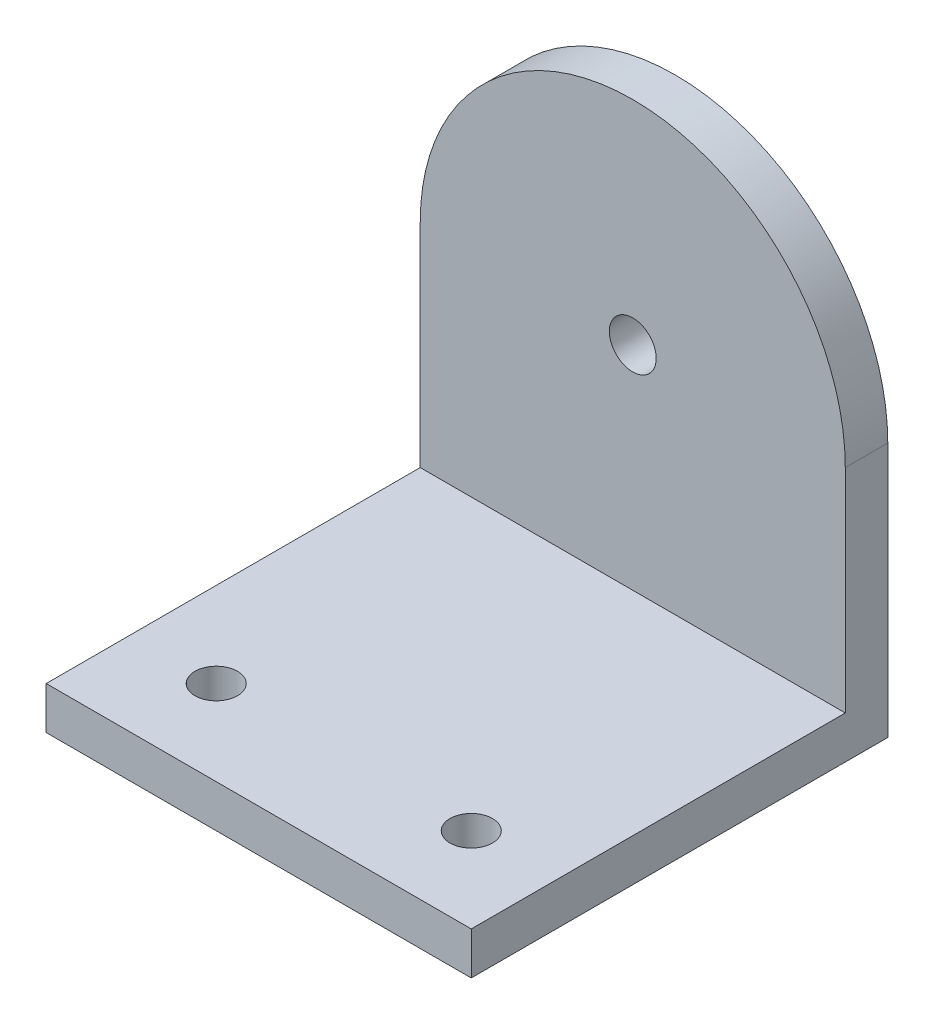
ISO-10303-21;
HEADER;
FILE_DESCRIPTION(('STEP AP214'),'2;1');
FILE_NAME('part.step','',(''),(''),'','','');
FILE_SCHEMA(('AUTOMOTIVE_DESIGN { 1 0 10303 214 1 1 1 1 }'));
ENDSEC;
DATA;
#1=APPLICATION_CONTEXT('core data for automotive mechanical design processes');
#2=APPLICATION_PROTOCOL_DEFINITION('international standard','automotive_design',2000,#1);
#3=PRODUCT_CONTEXT('',#1,'mechanical');
#4=PRODUCT('Part','Part','',(#3));
#5=PRODUCT_RELATED_PRODUCT_CATEGORY('part','',(#4));
#6=PRODUCT_DEFINITION_FORMATION('','',#4);
#7=PRODUCT_DEFINITION_CONTEXT('part definition',#1,'design');
#8=PRODUCT_DEFINITION('design','',#6,#7);
#9=PRODUCT_DEFINITION_SHAPE('','',#8);
#10=(LENGTH_UNIT() NAMED_UNIT(*) SI_UNIT(.MILLI.,.METRE.));
#11=(NAMED_UNIT(*) PLANE_ANGLE_UNIT() SI_UNIT($,.RADIAN.));
#12=(NAMED_UNIT(*) SI_UNIT($,.STERADIAN.) SOLID_ANGLE_UNIT());
#13=UNCERTAINTY_MEASURE_WITH_UNIT(LENGTH_MEASURE(1.E-05),#10,'distance_accuracy_value','');
#14=(GEOMETRIC_REPRESENTATION_CONTEXT(3) GLOBAL_UNCERTAINTY_ASSIGNED_CONTEXT((#13)) GLOBAL_UNIT_ASSIGNED_CONTEXT((#10,
#11,#12)) REPRESENTATION_CONTEXT('',''));
#15=CARTESIAN_POINT('',(0.,0.,0.));
#16=DIRECTION('',(0.,0.,1.));
#17=DIRECTION('',(1.,0.,0.));
#18=AXIS2_PLACEMENT_3D('',#15,#16,#17);
#19=CARTESIAN_POINT('',(0.,0.,3.175));
#20=DIRECTION('',(0.,0.,-1.));
#21=DIRECTION('',(-1.,0.,0.));
#22=AXIS2_PLACEMENT_3D('',#19,#20,#21);
#23=CYLINDRICAL_SURFACE('',#22,15.875);
#24=CARTESIAN_POINT('',(0.,0.,3.175));
#25=DIRECTION('',(0.,0.,1.));
#26=DIRECTION('',(1.,0.,0.));
#27=AXIS2_PLACEMENT_3D('',#24,#25,#26);
#28=CIRCLE('',#27,15.875);
#29=CARTESIAN_POINT('',(15.875,0.,3.175));
#30=VERTEX_POINT('',#29);
#31=CARTESIAN_POINT('',(-15.875,0.,3.175));
#32=VERTEX_POINT('',#31);
#33=EDGE_CURVE('E151',#30,#32,#28,.T.);
#34=ORIENTED_EDGE('',*,*,#33,.F.);
#35=DIRECTION('',(0.,0.,-1.));
#36=VECTOR('',#35,1.);
#37=CARTESIAN_POINT('',(15.875,0.,3.175));
#38=LINE('',#37,#36);
#39=CARTESIAN_POINT('',(15.875,0.,0.));
#40=VERTEX_POINT('',#39);
#41=EDGE_CURVE('E12',#30,#40,#38,.T.);
#42=ORIENTED_EDGE('',*,*,#41,.T.);
#43=CARTESIAN_POINT('',(0.,0.,0.));
#44=DIRECTION('',(0.,0.,1.));
#45=DIRECTION('',(1.,0.,0.));
#46=AXIS2_PLACEMENT_3D('',#43,#44,#45);
#47=CIRCLE('',#46,15.875);
#48=CARTESIAN_POINT('',(-15.875,0.,0.));
#49=VERTEX_POINT('',#48);
#50=EDGE_CURVE('E154',#40,#49,#47,.T.);
#51=ORIENTED_EDGE('',*,*,#50,.T.);
#52=DIRECTION('',(0.,0.,-1.));
#53=VECTOR('',#52,1.);
#54=CARTESIAN_POINT('',(-15.875,0.,3.175));
#55=LINE('',#54,#53);
#56=EDGE_CURVE('E67',#32,#49,#55,.T.);
#57=ORIENTED_EDGE('',*,*,#56,.F.);
#58=EDGE_LOOP('',(#34,#42,#51,#57));
#59=FACE_BOUND('',#58,.T.);
#60=ADVANCED_FACE('F58',(#59),#23,.T.);
#61=CARTESIAN_POINT('',(0.,0.,0.));
#62=DIRECTION('',(0.,0.,1.));
#63=DIRECTION('',(1.,0.,0.));
#64=AXIS2_PLACEMENT_3D('',#61,#62,#63);
#65=PLANE('',#64);
#66=CARTESIAN_POINT('',(0.,0.,0.));
#67=DIRECTION('',(0.,0.,1.));
#68=DIRECTION('',(1.,0.,0.));
#69=AXIS2_PLACEMENT_3D('',#66,#67,#68);
#70=CIRCLE('',#69,1.75);
#71=CARTESIAN_POINT('',(1.75,0.,0.));
#72=VERTEX_POINT('',#71);
#73=EDGE_CURVE('E219',#72,#72,#70,.T.);
#74=ORIENTED_EDGE('',*,*,#73,.T.);
#75=EDGE_LOOP('',(#74));
#76=FACE_BOUND('',#75,.T.);
#77=ORIENTED_EDGE('',*,*,#50,.F.);
#78=DIRECTION('',(0.,-1.,0.));
#79=VECTOR('',#78,1.);
#80=CARTESIAN_POINT('',(15.875,0.,0.));
#81=LINE('',#80,#79);
#82=CARTESIAN_POINT('',(15.875,-19.05,0.));
#83=VERTEX_POINT('',#82);
#84=EDGE_CURVE('E161',#40,#83,#81,.T.);
#85=ORIENTED_EDGE('',*,*,#84,.T.);
#86=DIRECTION('',(1.,0.,0.));
#87=VECTOR('',#86,1.);
#88=CARTESIAN_POINT('',(-15.875,-19.05,0.));
#89=LINE('',#88,#87);
#90=CARTESIAN_POINT('',(-15.875,-19.05,0.));
#91=VERTEX_POINT('',#90);
#92=EDGE_CURVE('E150',#91,#83,#89,.T.);
#93=ORIENTED_EDGE('',*,*,#92,.F.);
#94=DIRECTION('',(0.,-1.,0.));
#95=VECTOR('',#94,1.);
#96=CARTESIAN_POINT('',(-15.875,0.,0.));
#97=LINE('',#96,#95);
#98=EDGE_CURVE('E99',#49,#91,#97,.T.);
#99=ORIENTED_EDGE('',*,*,#98,.F.);
#100=EDGE_LOOP('',(#77,#85,#93,#99));
#101=FACE_BOUND('',#100,.T.);
#102=ADVANCED_FACE('F166',(#76,#101),#65,.F.);
#103=CARTESIAN_POINT('',(0.,0.,3.175));
#104=DIRECTION('',(0.,0.,1.));
#105=DIRECTION('',(1.,0.,0.));
#106=AXIS2_PLACEMENT_3D('',#103,#104,#105);
#107=PLANE('',#106);
#108=CARTESIAN_POINT('',(0.,0.,3.175));
#109=DIRECTION('',(0.,0.,1.));
#110=DIRECTION('',(1.,0.,0.));
#111=AXIS2_PLACEMENT_3D('',#108,#109,#110);
#112=CIRCLE('',#111,1.75);
#113=CARTESIAN_POINT('',(1.75,0.,3.175));
#114=VERTEX_POINT('',#113);
#115=EDGE_CURVE('E221',#114,#114,#112,.T.);
#116=ORIENTED_EDGE('',*,*,#115,.F.);
#117=EDGE_LOOP('',(#116));
#118=FACE_BOUND('',#117,.T.);
#119=DIRECTION('',(-1.,0.,0.));
#120=VECTOR('',#119,1.);
#121=CARTESIAN_POINT('',(-15.875,-15.875,3.175));
#122=LINE('',#121,#120);
#123=CARTESIAN_POINT('',(15.875,-15.875,3.175));
#124=VERTEX_POINT('',#123);
#125=CARTESIAN_POINT('',(-15.875,-15.875,3.175));
#126=VERTEX_POINT('',#125);
#127=EDGE_CURVE('E75',#124,#126,#122,.T.);
#128=ORIENTED_EDGE('',*,*,#127,.F.);
#129=DIRECTION('',(0.,-1.,0.));
#130=VECTOR('',#129,1.);
#131=CARTESIAN_POINT('',(15.875,0.,3.175));
#132=LINE('',#131,#130);
#133=EDGE_CURVE('E157',#30,#124,#132,.T.);
#134=ORIENTED_EDGE('',*,*,#133,.F.);
#135=ORIENTED_EDGE('',*,*,#33,.T.);
#136=DIRECTION('',(0.,-1.,0.));
#137=VECTOR('',#136,1.);
#138=CARTESIAN_POINT('',(-15.875,0.,3.175));
#139=LINE('',#138,#137);
#140=EDGE_CURVE('E125',#32,#126,#139,.T.);
#141=ORIENTED_EDGE('',*,*,#140,.T.);
#142=EDGE_LOOP('',(#128,#134,#135,#141));
#143=FACE_BOUND('',#142,.T.);
#144=ADVANCED_FACE('F172',(#118,#143),#107,.T.);
#145=CARTESIAN_POINT('',(-15.875,0.,3.175));
#146=DIRECTION('',(1.,0.,0.));
#147=DIRECTION('',(0.,1.,0.));
#148=AXIS2_PLACEMENT_3D('',#145,#146,#147);
#149=PLANE('',#148);
#150=ORIENTED_EDGE('',*,*,#98,.T.);
#151=DIRECTION('',(0.,0.,-1.));
#152=VECTOR('',#151,1.);
#153=CARTESIAN_POINT('',(-15.875,-19.05,3.175));
#154=LINE('',#153,#152);
#155=CARTESIAN_POINT('',(-15.875,-19.05,31.115));
#156=VERTEX_POINT('',#155);
#157=EDGE_CURVE('E116',#156,#91,#154,.T.);
#158=ORIENTED_EDGE('',*,*,#157,.F.);
#159=DIRECTION('',(0.,-1.,0.));
#160=VECTOR('',#159,1.);
#161=CARTESIAN_POINT('',(-15.875,-19.05,31.115));
#162=LINE('',#161,#160);
#163=CARTESIAN_POINT('',(-15.875,-15.875,31.115));
#164=VERTEX_POINT('',#163);
#165=EDGE_CURVE('E121',#164,#156,#162,.T.);
#166=ORIENTED_EDGE('',*,*,#165,.F.);
#167=DIRECTION('',(0.,0.,-1.));
#168=VECTOR('',#167,1.);
#169=CARTESIAN_POINT('',(-15.875,-15.875,31.115));
#170=LINE('',#169,#168);
#171=EDGE_CURVE('E144',#164,#126,#170,.T.);
#172=ORIENTED_EDGE('',*,*,#171,.T.);
#173=ORIENTED_EDGE('',*,*,#140,.F.);
#174=ORIENTED_EDGE('',*,*,#56,.T.);
#175=EDGE_LOOP('',(#150,#158,#166,#172,#173,#174));
#176=FACE_BOUND('',#175,.T.);
#177=ADVANCED_FACE('F118',(#176),#149,.F.);
#178=CARTESIAN_POINT('',(-15.875,-19.05,3.175));
#179=DIRECTION('',(0.,1.,0.));
#180=DIRECTION('',(0.,0.,1.));
#181=AXIS2_PLACEMENT_3D('',#178,#179,#180);
#182=PLANE('',#181);
#183=CARTESIAN_POINT('',(-9.525,-19.05,24.765));
#184=DIRECTION('',(0.,1.,0.));
#185=DIRECTION('',(0.,0.,1.));
#186=AXIS2_PLACEMENT_3D('',#183,#184,#185);
#187=CIRCLE('',#186,1.5875);
#188=CARTESIAN_POINT('',(-9.525,-19.05,26.3525));
#189=VERTEX_POINT('',#188);
#190=EDGE_CURVE('E137',#189,#189,#187,.T.);
#191=ORIENTED_EDGE('',*,*,#190,.T.);
#192=EDGE_LOOP('',(#191));
#193=FACE_BOUND('',#192,.T.);
#194=CARTESIAN_POINT('',(9.525,-19.05,24.765));
#195=DIRECTION('',(0.,1.,0.));
#196=DIRECTION('',(0.,0.,-1.));
#197=AXIS2_PLACEMENT_3D('',#194,#195,#196);
#198=CIRCLE('',#197,1.5875);
#199=CARTESIAN_POINT('',(9.525,-19.05,23.1775));
#200=VERTEX_POINT('',#199);
#201=EDGE_CURVE('E140',#200,#200,#198,.T.);
#202=ORIENTED_EDGE('',*,*,#201,.T.);
#203=EDGE_LOOP('',(#202));
#204=FACE_BOUND('',#203,.T.);
#205=ORIENTED_EDGE('',*,*,#92,.T.);
#206=DIRECTION('',(0.,0.,-1.));
#207=VECTOR('',#206,1.);
#208=CARTESIAN_POINT('',(15.875,-19.05,3.175));
#209=LINE('',#208,#207);
#210=CARTESIAN_POINT('',(15.875,-19.05,31.115));
#211=VERTEX_POINT('',#210);
#212=EDGE_CURVE('E62',#211,#83,#209,.T.);
#213=ORIENTED_EDGE('',*,*,#212,.F.);
#214=DIRECTION('',(1.,0.,0.));
#215=VECTOR('',#214,1.);
#216=CARTESIAN_POINT('',(-15.875,-19.05,31.115));
#217=LINE('',#216,#215);
#218=EDGE_CURVE('E127',#156,#211,#217,.T.);
#219=ORIENTED_EDGE('',*,*,#218,.F.);
#220=ORIENTED_EDGE('',*,*,#157,.T.);
#221=EDGE_LOOP('',(#205,#213,#219,#220));
#222=FACE_BOUND('',#221,.T.);
#223=ADVANCED_FACE('F60',(#193,#204,#222),#182,.F.);
#224=CARTESIAN_POINT('',(15.875,0.,3.175));
#225=DIRECTION('',(1.,0.,0.));
#226=DIRECTION('',(0.,1.,0.));
#227=AXIS2_PLACEMENT_3D('',#224,#225,#226);
#228=PLANE('',#227);
#229=ORIENTED_EDGE('',*,*,#84,.F.);
#230=ORIENTED_EDGE('',*,*,#41,.F.);
#231=ORIENTED_EDGE('',*,*,#133,.T.);
#232=DIRECTION('',(0.,0.,-1.));
#233=VECTOR('',#232,1.);
#234=CARTESIAN_POINT('',(15.875,-15.875,31.115));
#235=LINE('',#234,#233);
#236=CARTESIAN_POINT('',(15.875,-15.875,31.115));
#237=VERTEX_POINT('',#236);
#238=EDGE_CURVE('E147',#237,#124,#235,.T.);
#239=ORIENTED_EDGE('',*,*,#238,.F.);
#240=DIRECTION('',(0.,1.,0.));
#241=VECTOR('',#240,1.);
#242=CARTESIAN_POINT('',(15.875,-19.05,31.115));
#243=LINE('',#242,#241);
#244=EDGE_CURVE('E130',#211,#237,#243,.T.);
#245=ORIENTED_EDGE('',*,*,#244,.F.);
#246=ORIENTED_EDGE('',*,*,#212,.T.);
#247=EDGE_LOOP('',(#229,#230,#231,#239,#245,#246));
#248=FACE_BOUND('',#247,.T.);
#249=ADVANCED_FACE('F168',(#248),#228,.T.);
#250=CARTESIAN_POINT('',(-15.875,-15.875,31.115));
#251=DIRECTION('',(0.,-1.,0.));
#252=DIRECTION('',(0.,0.,-1.));
#253=AXIS2_PLACEMENT_3D('',#250,#251,#252);
#254=PLANE('',#253);
#255=CARTESIAN_POINT('',(-9.525,-15.875,24.765));
#256=DIRECTION('',(0.,1.,0.));
#257=DIRECTION('',(0.,0.,1.));
#258=AXIS2_PLACEMENT_3D('',#255,#256,#257);
#259=CIRCLE('',#258,1.5875);
#260=CARTESIAN_POINT('',(-9.525,-15.875,26.3525));
#261=VERTEX_POINT('',#260);
#262=EDGE_CURVE('E226',#261,#261,#259,.T.);
#263=ORIENTED_EDGE('',*,*,#262,.F.);
#264=EDGE_LOOP('',(#263));
#265=FACE_BOUND('',#264,.T.);
#266=CARTESIAN_POINT('',(9.525,-15.875,24.765));
#267=DIRECTION('',(0.,1.,0.));
#268=DIRECTION('',(0.,0.,-1.));
#269=AXIS2_PLACEMENT_3D('',#266,#267,#268);
#270=CIRCLE('',#269,1.5875);
#271=CARTESIAN_POINT('',(9.525,-15.875,23.1775));
#272=VERTEX_POINT('',#271);
#273=EDGE_CURVE('E228',#272,#272,#270,.T.);
#274=ORIENTED_EDGE('',*,*,#273,.F.);
#275=EDGE_LOOP('',(#274));
#276=FACE_BOUND('',#275,.T.);
#277=ORIENTED_EDGE('',*,*,#127,.T.);
#278=ORIENTED_EDGE('',*,*,#171,.F.);
#279=DIRECTION('',(-1.,0.,0.));
#280=VECTOR('',#279,1.);
#281=CARTESIAN_POINT('',(-15.875,-15.875,31.115));
#282=LINE('',#281,#280);
#283=EDGE_CURVE('E134',#237,#164,#282,.T.);
#284=ORIENTED_EDGE('',*,*,#283,.F.);
#285=ORIENTED_EDGE('',*,*,#238,.T.);
#286=EDGE_LOOP('',(#277,#278,#284,#285));
#287=FACE_BOUND('',#286,.T.);
#288=ADVANCED_FACE('F171',(#265,#276,#287),#254,.F.);
#289=CARTESIAN_POINT('',(0.,0.,31.115));
#290=DIRECTION('',(0.,0.,-1.));
#291=DIRECTION('',(-1.,0.,0.));
#292=AXIS2_PLACEMENT_3D('',#289,#290,#291);
#293=PLANE('',#292);
#294=ORIENTED_EDGE('',*,*,#165,.T.);
#295=ORIENTED_EDGE('',*,*,#218,.T.);
#296=ORIENTED_EDGE('',*,*,#244,.T.);
#297=ORIENTED_EDGE('',*,*,#283,.T.);
#298=EDGE_LOOP('',(#294,#295,#296,#297));
#299=FACE_BOUND('',#298,.T.);
#300=ADVANCED_FACE('F132',(#299),#293,.F.);
#301=CARTESIAN_POINT('',(9.525,-19.05,24.765));
#302=DIRECTION('',(0.,1.,0.));
#303=DIRECTION('',(0.,0.,1.));
#304=AXIS2_PLACEMENT_3D('',#301,#302,#303);
#305=CYLINDRICAL_SURFACE('',#304,1.5875);
#306=ORIENTED_EDGE('',*,*,#201,.F.);
#307=EDGE_LOOP('',(#306));
#308=FACE_BOUND('',#307,.T.);
#309=ORIENTED_EDGE('',*,*,#273,.T.);
#310=EDGE_LOOP('',(#309));
#311=FACE_BOUND('',#310,.T.);
#312=ADVANCED_FACE('F204',(#308,#311),#305,.F.);
#313=CARTESIAN_POINT('',(-9.525,-19.05,24.765));
#314=DIRECTION('',(0.,1.,0.));
#315=DIRECTION('',(0.,0.,1.));
#316=AXIS2_PLACEMENT_3D('',#313,#314,#315);
#317=CYLINDRICAL_SURFACE('',#316,1.5875);
#318=ORIENTED_EDGE('',*,*,#190,.F.);
#319=EDGE_LOOP('',(#318));
#320=FACE_BOUND('',#319,.T.);
#321=ORIENTED_EDGE('',*,*,#262,.T.);
#322=EDGE_LOOP('',(#321));
#323=FACE_BOUND('',#322,.T.);
#324=ADVANCED_FACE('F207',(#320,#323),#317,.F.);
#325=CARTESIAN_POINT('',(0.,0.,0.));
#326=DIRECTION('',(0.,0.,1.));
#327=DIRECTION('',(1.,0.,0.));
#328=AXIS2_PLACEMENT_3D('',#325,#326,#327);
#329=CYLINDRICAL_SURFACE('',#328,1.75);
#330=ORIENTED_EDGE('',*,*,#73,.F.);
#331=EDGE_LOOP('',(#330));
#332=FACE_BOUND('',#331,.T.);
#333=ORIENTED_EDGE('',*,*,#115,.T.);
#334=EDGE_LOOP('',(#333));
#335=FACE_BOUND('',#334,.T.);
#336=ADVANCED_FACE('F211',(#332,#335),#329,.F.);
#337=CLOSED_SHELL('',(#60,#102,#144,#177,#223,#249,#288,#300,#312,#324,#336));
#338=MANIFOLD_SOLID_BREP('B2',#337);
#339=ADVANCED_BREP_SHAPE_REPRESENTATION('',(#18,#338),#14);
#340=SHAPE_DEFINITION_REPRESENTATION(#9,#339);
ENDSEC;
END-ISO-10303-21;
